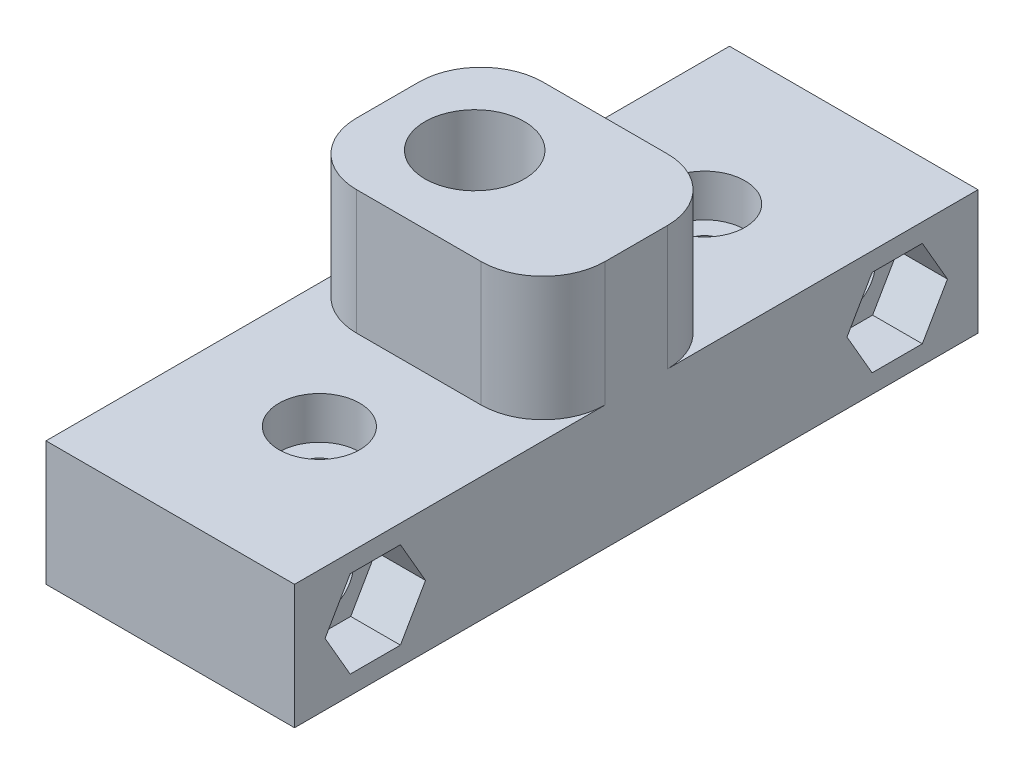
ISO-10303-21;
HEADER;
FILE_DESCRIPTION(('STEP AP214'),'2;1');
FILE_NAME('part.step','',(''),(''),'','','');
FILE_SCHEMA(('AUTOMOTIVE_DESIGN { 1 0 10303 214 1 1 1 1 }'));
ENDSEC;
DATA;
#1=APPLICATION_CONTEXT('core data for automotive mechanical design processes');
#2=APPLICATION_PROTOCOL_DEFINITION('international standard','automotive_design',2000,#1);
#3=PRODUCT_CONTEXT('',#1,'mechanical');
#4=PRODUCT('Part','Part','',(#3));
#5=PRODUCT_RELATED_PRODUCT_CATEGORY('part','',(#4));
#6=PRODUCT_DEFINITION_FORMATION('','',#4);
#7=PRODUCT_DEFINITION_CONTEXT('part definition',#1,'design');
#8=PRODUCT_DEFINITION('design','',#6,#7);
#9=PRODUCT_DEFINITION_SHAPE('','',#8);
#10=(LENGTH_UNIT() NAMED_UNIT(*) SI_UNIT(.MILLI.,.METRE.));
#11=(NAMED_UNIT(*) PLANE_ANGLE_UNIT() SI_UNIT($,.RADIAN.));
#12=(NAMED_UNIT(*) SI_UNIT($,.STERADIAN.) SOLID_ANGLE_UNIT());
#13=UNCERTAINTY_MEASURE_WITH_UNIT(LENGTH_MEASURE(1.E-05),#10,'distance_accuracy_value','');
#14=(GEOMETRIC_REPRESENTATION_CONTEXT(3) GLOBAL_UNCERTAINTY_ASSIGNED_CONTEXT((#13)) GLOBAL_UNIT_ASSIGNED_CONTEXT((#10,
#11,#12)) REPRESENTATION_CONTEXT('',''));
#15=CARTESIAN_POINT('',(0.,0.,0.));
#16=DIRECTION('',(0.,0.,1.));
#17=DIRECTION('',(1.,0.,0.));
#18=AXIS2_PLACEMENT_3D('',#15,#16,#17);
#19=CARTESIAN_POINT('',(10.,5.,21.));
#20=DIRECTION('',(-1.,0.,0.));
#21=DIRECTION('',(0.,0.,1.));
#22=AXIS2_PLACEMENT_3D('',#19,#20,#21);
#23=CYLINDRICAL_SURFACE('',#22,2.25);
#24=CARTESIAN_POINT('',(-10.,5.,21.));
#25=DIRECTION('',(-1.,0.,0.));
#26=DIRECTION('',(0.,0.,1.));
#27=AXIS2_PLACEMENT_3D('',#24,#25,#26);
#28=CIRCLE('',#27,2.25);
#29=CARTESIAN_POINT('',(-10.,5.,23.25));
#30=VERTEX_POINT('',#29);
#31=EDGE_CURVE('E301',#30,#30,#28,.T.);
#32=ORIENTED_EDGE('',*,*,#31,.T.);
#33=EDGE_LOOP('',(#32));
#34=FACE_BOUND('',#33,.T.);
#35=CARTESIAN_POINT('',(6.,5.,21.));
#36=DIRECTION('',(1.,0.,0.));
#37=DIRECTION('',(0.,0.,-1.));
#38=AXIS2_PLACEMENT_3D('',#35,#36,#37);
#39=CIRCLE('',#38,2.25);
#40=CARTESIAN_POINT('',(6.,5.,18.75));
#41=VERTEX_POINT('',#40);
#42=EDGE_CURVE('E37',#41,#41,#39,.F.);
#43=ORIENTED_EDGE('',*,*,#42,.F.);
#44=EDGE_LOOP('',(#43));
#45=FACE_BOUND('',#44,.T.);
#46=ADVANCED_FACE('F33',(#34,#45),#23,.F.);
#47=CARTESIAN_POINT('',(10.,5.,-21.));
#48=DIRECTION('',(-1.,0.,0.));
#49=DIRECTION('',(0.,0.,1.));
#50=AXIS2_PLACEMENT_3D('',#47,#48,#49);
#51=CYLINDRICAL_SURFACE('',#50,2.25);
#52=CARTESIAN_POINT('',(-10.,5.,-21.));
#53=DIRECTION('',(-1.,0.,0.));
#54=DIRECTION('',(0.,0.,1.));
#55=AXIS2_PLACEMENT_3D('',#52,#53,#54);
#56=CIRCLE('',#55,2.25);
#57=CARTESIAN_POINT('',(-10.,5.,-18.75));
#58=VERTEX_POINT('',#57);
#59=EDGE_CURVE('E297',#58,#58,#56,.T.);
#60=ORIENTED_EDGE('',*,*,#59,.T.);
#61=EDGE_LOOP('',(#60));
#62=FACE_BOUND('',#61,.T.);
#63=CARTESIAN_POINT('',(6.,5.,-21.));
#64=DIRECTION('',(1.,0.,0.));
#65=DIRECTION('',(0.,0.,-1.));
#66=AXIS2_PLACEMENT_3D('',#63,#64,#65);
#67=CIRCLE('',#66,2.25);
#68=CARTESIAN_POINT('',(6.,5.,-23.25));
#69=VERTEX_POINT('',#68);
#70=EDGE_CURVE('E244',#69,#69,#67,.F.);
#71=ORIENTED_EDGE('',*,*,#70,.F.);
#72=EDGE_LOOP('',(#71));
#73=FACE_BOUND('',#72,.T.);
#74=ADVANCED_FACE('F426',(#62,#73),#51,.F.);
#75=CARTESIAN_POINT('',(-10.,20.,-27.5));
#76=DIRECTION('',(0.,0.,1.));
#77=DIRECTION('',(1.,0.,0.));
#78=AXIS2_PLACEMENT_3D('',#75,#76,#77);
#79=PLANE('',#78);
#80=DIRECTION('',(-1.,0.,0.));
#81=VECTOR('',#80,1.);
#82=CARTESIAN_POINT('',(-10.,10.,-27.5));
#83=LINE('',#82,#81);
#84=CARTESIAN_POINT('',(10.,10.,-27.5));
#85=VERTEX_POINT('',#84);
#86=CARTESIAN_POINT('',(-10.,10.,-27.5));
#87=VERTEX_POINT('',#86);
#88=EDGE_CURVE('E341',#85,#87,#83,.T.);
#89=ORIENTED_EDGE('',*,*,#88,.F.);
#90=DIRECTION('',(0.,-1.,0.));
#91=VECTOR('',#90,1.);
#92=CARTESIAN_POINT('',(10.,20.,-27.5));
#93=LINE('',#92,#91);
#94=CARTESIAN_POINT('',(10.,0.,-27.5));
#95=VERTEX_POINT('',#94);
#96=EDGE_CURVE('E381',#85,#95,#93,.T.);
#97=ORIENTED_EDGE('',*,*,#96,.T.);
#98=DIRECTION('',(-1.,0.,0.));
#99=VECTOR('',#98,1.);
#100=CARTESIAN_POINT('',(-10.,0.,-27.5));
#101=LINE('',#100,#99);
#102=CARTESIAN_POINT('',(-10.,0.,-27.5));
#103=VERTEX_POINT('',#102);
#104=EDGE_CURVE('E368',#95,#103,#101,.T.);
#105=ORIENTED_EDGE('',*,*,#104,.T.);
#106=DIRECTION('',(0.,-1.,0.));
#107=VECTOR('',#106,1.);
#108=CARTESIAN_POINT('',(-10.,20.,-27.5));
#109=LINE('',#108,#107);
#110=EDGE_CURVE('E379',#87,#103,#109,.T.);
#111=ORIENTED_EDGE('',*,*,#110,.F.);
#112=EDGE_LOOP('',(#89,#97,#105,#111));
#113=FACE_BOUND('',#112,.T.);
#114=ADVANCED_FACE('F433',(#113),#79,.F.);
#115=CARTESIAN_POINT('',(10.,20.,27.5));
#116=DIRECTION('',(-1.,0.,0.));
#117=DIRECTION('',(0.,0.,1.));
#118=AXIS2_PLACEMENT_3D('',#115,#116,#117);
#119=PLANE('',#118);
#120=DIRECTION('',(0.,0.866025403784438,0.5));
#121=VECTOR('',#120,1.);
#122=CARTESIAN_POINT('',(10.,5.,16.9585481156726));
#123=LINE('',#122,#121);
#124=CARTESIAN_POINT('',(10.,5.,16.9585481156726));
#125=VERTEX_POINT('',#124);
#126=CARTESIAN_POINT('',(10.,8.5,18.9792740578363));
#127=VERTEX_POINT('',#126);
#128=EDGE_CURVE('E231',#125,#127,#123,.T.);
#129=ORIENTED_EDGE('',*,*,#128,.F.);
#130=DIRECTION('',(0.,0.866025403784439,-0.5));
#131=VECTOR('',#130,1.);
#132=CARTESIAN_POINT('',(10.,1.49999999999999,18.9792740578363));
#133=LINE('',#132,#131);
#134=CARTESIAN_POINT('',(10.,1.49999999999999,18.9792740578363));
#135=VERTEX_POINT('',#134);
#136=EDGE_CURVE('E50',#135,#125,#133,.T.);
#137=ORIENTED_EDGE('',*,*,#136,.F.);
#138=DIRECTION('',(0.,0.,-1.));
#139=VECTOR('',#138,1.);
#140=CARTESIAN_POINT('',(10.,1.49999999999999,23.0207259421637));
#141=LINE('',#140,#139);
#142=CARTESIAN_POINT('',(10.,1.49999999999999,23.0207259421637));
#143=VERTEX_POINT('',#142);
#144=EDGE_CURVE('E217',#143,#135,#141,.T.);
#145=ORIENTED_EDGE('',*,*,#144,.F.);
#146=DIRECTION('',(0.,-0.866025403784438,-0.5));
#147=VECTOR('',#146,1.);
#148=CARTESIAN_POINT('',(10.,5.,25.0414518843274));
#149=LINE('',#148,#147);
#150=CARTESIAN_POINT('',(10.,5.,25.0414518843274));
#151=VERTEX_POINT('',#150);
#152=EDGE_CURVE('E220',#151,#143,#149,.T.);
#153=ORIENTED_EDGE('',*,*,#152,.F.);
#154=DIRECTION('',(0.,-0.866025403784439,0.5));
#155=VECTOR('',#154,1.);
#156=CARTESIAN_POINT('',(10.,8.5,23.0207259421637));
#157=LINE('',#156,#155);
#158=CARTESIAN_POINT('',(10.,8.5,23.0207259421637));
#159=VERTEX_POINT('',#158);
#160=EDGE_CURVE('E237',#159,#151,#157,.T.);
#161=ORIENTED_EDGE('',*,*,#160,.F.);
#162=DIRECTION('',(0.,0.,1.));
#163=VECTOR('',#162,1.);
#164=CARTESIAN_POINT('',(10.,8.5,18.9792740578363));
#165=LINE('',#164,#163);
#166=EDGE_CURVE('E234',#127,#159,#165,.T.);
#167=ORIENTED_EDGE('',*,*,#166,.F.);
#168=EDGE_LOOP('',(#129,#137,#145,#153,#161,#167));
#169=FACE_BOUND('',#168,.T.);
#170=DIRECTION('',(0.,-0.866025403784438,-0.5));
#171=VECTOR('',#170,1.);
#172=CARTESIAN_POINT('',(10.,5.,-16.9585481156726));
#173=LINE('',#172,#171);
#174=CARTESIAN_POINT('',(10.,5.,-16.9585481156726));
#175=VERTEX_POINT('',#174);
#176=CARTESIAN_POINT('',(10.,1.5,-18.9792740578363));
#177=VERTEX_POINT('',#176);
#178=EDGE_CURVE('E273',#175,#177,#173,.T.);
#179=ORIENTED_EDGE('',*,*,#178,.F.);
#180=DIRECTION('',(0.,-0.866025403784439,0.5));
#181=VECTOR('',#180,1.);
#182=CARTESIAN_POINT('',(10.,8.5,-18.9792740578363));
#183=LINE('',#182,#181);
#184=CARTESIAN_POINT('',(10.,8.5,-18.9792740578363));
#185=VERTEX_POINT('',#184);
#186=EDGE_CURVE('E58',#185,#175,#183,.T.);
#187=ORIENTED_EDGE('',*,*,#186,.F.);
#188=DIRECTION('',(0.,0.,1.));
#189=VECTOR('',#188,1.);
#190=CARTESIAN_POINT('',(10.,8.5,-23.0207259421637));
#191=LINE('',#190,#189);
#192=CARTESIAN_POINT('',(10.,8.5,-23.0207259421637));
#193=VERTEX_POINT('',#192);
#194=EDGE_CURVE('E256',#193,#185,#191,.T.);
#195=ORIENTED_EDGE('',*,*,#194,.F.);
#196=DIRECTION('',(0.,0.866025403784439,0.5));
#197=VECTOR('',#196,1.);
#198=CARTESIAN_POINT('',(10.,5.,-25.0414518843274));
#199=LINE('',#198,#197);
#200=CARTESIAN_POINT('',(10.,5.,-25.0414518843274));
#201=VERTEX_POINT('',#200);
#202=EDGE_CURVE('E282',#201,#193,#199,.T.);
#203=ORIENTED_EDGE('',*,*,#202,.F.);
#204=DIRECTION('',(0.,0.866025403784439,-0.499999999999999));
#205=VECTOR('',#204,1.);
#206=CARTESIAN_POINT('',(10.,1.5,-23.0207259421637));
#207=LINE('',#206,#205);
#208=CARTESIAN_POINT('',(10.,1.5,-23.0207259421637));
#209=VERTEX_POINT('',#208);
#210=EDGE_CURVE('E279',#209,#201,#207,.T.);
#211=ORIENTED_EDGE('',*,*,#210,.F.);
#212=DIRECTION('',(0.,0.,-1.));
#213=VECTOR('',#212,1.);
#214=CARTESIAN_POINT('',(10.,1.5,-18.9792740578363));
#215=LINE('',#214,#213);
#216=EDGE_CURVE('E276',#177,#209,#215,.T.);
#217=ORIENTED_EDGE('',*,*,#216,.F.);
#218=EDGE_LOOP('',(#179,#187,#195,#203,#211,#217));
#219=FACE_BOUND('',#218,.T.);
#220=DIRECTION('',(0.,0.,-1.));
#221=VECTOR('',#220,1.);
#222=CARTESIAN_POINT('',(10.,10.,-27.5));
#223=LINE('',#222,#221);
#224=CARTESIAN_POINT('',(10.,10.,-2.50000000000001));
#225=VERTEX_POINT('',#224);
#226=EDGE_CURVE('E347',#225,#85,#223,.T.);
#227=ORIENTED_EDGE('',*,*,#226,.F.);
#228=DIRECTION('',(0.,1.,0.));
#229=VECTOR('',#228,1.);
#230=CARTESIAN_POINT('',(10.,20.,-2.50000000000001));
#231=LINE('',#230,#229);
#232=CARTESIAN_POINT('',(10.,20.,-2.50000000000001));
#233=VERTEX_POINT('',#232);
#234=EDGE_CURVE('E410',#225,#233,#231,.T.);
#235=ORIENTED_EDGE('',*,*,#234,.T.);
#236=DIRECTION('',(0.,0.,-1.));
#237=VECTOR('',#236,1.);
#238=CARTESIAN_POINT('',(10.,20.,27.5));
#239=LINE('',#238,#237);
#240=CARTESIAN_POINT('',(10.,20.,2.5));
#241=VERTEX_POINT('',#240);
#242=EDGE_CURVE('E358',#241,#233,#239,.T.);
#243=ORIENTED_EDGE('',*,*,#242,.F.);
#244=DIRECTION('',(0.,1.,0.));
#245=VECTOR('',#244,1.);
#246=CARTESIAN_POINT('',(10.,20.,2.5));
#247=LINE('',#246,#245);
#248=CARTESIAN_POINT('',(10.,10.,2.5));
#249=VERTEX_POINT('',#248);
#250=EDGE_CURVE('E407',#241,#249,#247,.F.);
#251=ORIENTED_EDGE('',*,*,#250,.T.);
#252=DIRECTION('',(0.,0.,-1.));
#253=VECTOR('',#252,1.);
#254=CARTESIAN_POINT('',(10.,10.,27.5));
#255=LINE('',#254,#253);
#256=CARTESIAN_POINT('',(10.,10.,27.5));
#257=VERTEX_POINT('',#256);
#258=EDGE_CURVE('E333',#257,#249,#255,.T.);
#259=ORIENTED_EDGE('',*,*,#258,.F.);
#260=DIRECTION('',(0.,-1.,0.));
#261=VECTOR('',#260,1.);
#262=CARTESIAN_POINT('',(10.,20.,27.5));
#263=LINE('',#262,#261);
#264=CARTESIAN_POINT('',(10.,0.,27.5));
#265=VERTEX_POINT('',#264);
#266=EDGE_CURVE('E365',#257,#265,#263,.T.);
#267=ORIENTED_EDGE('',*,*,#266,.T.);
#268=DIRECTION('',(0.,0.,-1.));
#269=VECTOR('',#268,1.);
#270=CARTESIAN_POINT('',(10.,0.,27.5));
#271=LINE('',#270,#269);
#272=EDGE_CURVE('E355',#265,#95,#271,.T.);
#273=ORIENTED_EDGE('',*,*,#272,.T.);
#274=ORIENTED_EDGE('',*,*,#96,.F.);
#275=EDGE_LOOP('',(#227,#235,#243,#251,#259,#267,#273,#274));
#276=FACE_BOUND('',#275,.T.);
#277=ADVANCED_FACE('F502',(#169,#219,#276),#119,.F.);
#278=CARTESIAN_POINT('',(-10.,20.,27.5));
#279=DIRECTION('',(1.,0.,0.));
#280=DIRECTION('',(0.,0.,-1.));
#281=AXIS2_PLACEMENT_3D('',#278,#279,#280);
#282=PLANE('',#281);
#283=ORIENTED_EDGE('',*,*,#59,.F.);
#284=EDGE_LOOP('',(#283));
#285=FACE_BOUND('',#284,.T.);
#286=ORIENTED_EDGE('',*,*,#31,.F.);
#287=EDGE_LOOP('',(#286));
#288=FACE_BOUND('',#287,.T.);
#289=DIRECTION('',(0.,0.,1.));
#290=VECTOR('',#289,1.);
#291=CARTESIAN_POINT('',(-10.,20.,27.5));
#292=LINE('',#291,#290);
#293=CARTESIAN_POINT('',(-10.,20.,-2.50000000000001));
#294=VERTEX_POINT('',#293);
#295=CARTESIAN_POINT('',(-10.,20.,2.5));
#296=VERTEX_POINT('',#295);
#297=EDGE_CURVE('E361',#294,#296,#292,.T.);
#298=ORIENTED_EDGE('',*,*,#297,.F.);
#299=DIRECTION('',(0.,1.,0.));
#300=VECTOR('',#299,1.);
#301=CARTESIAN_POINT('',(-10.,20.,-2.50000000000001));
#302=LINE('',#301,#300);
#303=CARTESIAN_POINT('',(-10.,10.,-2.50000000000001));
#304=VERTEX_POINT('',#303);
#305=EDGE_CURVE('E399',#294,#304,#302,.F.);
#306=ORIENTED_EDGE('',*,*,#305,.T.);
#307=DIRECTION('',(0.,0.,1.));
#308=VECTOR('',#307,1.);
#309=CARTESIAN_POINT('',(-10.,10.,-27.5));
#310=LINE('',#309,#308);
#311=EDGE_CURVE('E342',#87,#304,#310,.T.);
#312=ORIENTED_EDGE('',*,*,#311,.F.);
#313=ORIENTED_EDGE('',*,*,#110,.T.);
#314=DIRECTION('',(0.,0.,1.));
#315=VECTOR('',#314,1.);
#316=CARTESIAN_POINT('',(-10.,0.,27.5));
#317=LINE('',#316,#315);
#318=CARTESIAN_POINT('',(-10.,0.,27.5));
#319=VERTEX_POINT('',#318);
#320=EDGE_CURVE('E371',#103,#319,#317,.T.);
#321=ORIENTED_EDGE('',*,*,#320,.T.);
#322=DIRECTION('',(0.,-1.,0.));
#323=VECTOR('',#322,1.);
#324=CARTESIAN_POINT('',(-10.,20.,27.5));
#325=LINE('',#324,#323);
#326=CARTESIAN_POINT('',(-10.,10.,27.5));
#327=VERTEX_POINT('',#326);
#328=EDGE_CURVE('E377',#327,#319,#325,.T.);
#329=ORIENTED_EDGE('',*,*,#328,.F.);
#330=DIRECTION('',(0.,0.,1.));
#331=VECTOR('',#330,1.);
#332=CARTESIAN_POINT('',(-10.,10.,27.5));
#333=LINE('',#332,#331);
#334=CARTESIAN_POINT('',(-10.,10.,2.5));
#335=VERTEX_POINT('',#334);
#336=EDGE_CURVE('E328',#335,#327,#333,.T.);
#337=ORIENTED_EDGE('',*,*,#336,.F.);
#338=DIRECTION('',(0.,1.,0.));
#339=VECTOR('',#338,1.);
#340=CARTESIAN_POINT('',(-10.,20.,2.5));
#341=LINE('',#340,#339);
#342=EDGE_CURVE('E396',#335,#296,#341,.T.);
#343=ORIENTED_EDGE('',*,*,#342,.T.);
#344=EDGE_LOOP('',(#298,#306,#312,#313,#321,#329,#337,#343));
#345=FACE_BOUND('',#344,.T.);
#346=ADVANCED_FACE('F498',(#285,#288,#345),#282,.F.);
#347=CARTESIAN_POINT('',(-10.,20.,27.5));
#348=DIRECTION('',(0.,0.,-1.));
#349=DIRECTION('',(-1.,0.,0.));
#350=AXIS2_PLACEMENT_3D('',#347,#348,#349);
#351=PLANE('',#350);
#352=ORIENTED_EDGE('',*,*,#266,.F.);
#353=DIRECTION('',(1.,0.,0.));
#354=VECTOR('',#353,1.);
#355=CARTESIAN_POINT('',(-10.,10.,27.5));
#356=LINE('',#355,#354);
#357=EDGE_CURVE('E330',#327,#257,#356,.T.);
#358=ORIENTED_EDGE('',*,*,#357,.F.);
#359=ORIENTED_EDGE('',*,*,#328,.T.);
#360=DIRECTION('',(1.,0.,0.));
#361=VECTOR('',#360,1.);
#362=CARTESIAN_POINT('',(-10.,0.,27.5));
#363=LINE('',#362,#361);
#364=EDGE_CURVE('E362',#319,#265,#363,.T.);
#365=ORIENTED_EDGE('',*,*,#364,.T.);
#366=EDGE_LOOP('',(#352,#358,#359,#365));
#367=FACE_BOUND('',#366,.T.);
#368=ADVANCED_FACE('F491',(#367),#351,.F.);
#369=CARTESIAN_POINT('',(0.,20.,0.));
#370=DIRECTION('',(0.,-1.,0.));
#371=DIRECTION('',(0.,0.,-1.));
#372=AXIS2_PLACEMENT_3D('',#369,#370,#371);
#373=PLANE('',#372);
#374=CARTESIAN_POINT('',(-3.,20.,0.));
#375=DIRECTION('',(0.,1.,0.));
#376=DIRECTION('',(0.,0.,1.));
#377=AXIS2_PLACEMENT_3D('',#374,#375,#376);
#378=CIRCLE('',#377,4.);
#379=CARTESIAN_POINT('',(-3.,20.,4.));
#380=VERTEX_POINT('',#379);
#381=EDGE_CURVE('E338',#380,#380,#378,.T.);
#382=ORIENTED_EDGE('',*,*,#381,.F.);
#383=EDGE_LOOP('',(#382));
#384=FACE_BOUND('',#383,.T.);
#385=DIRECTION('',(1.,0.,0.));
#386=VECTOR('',#385,1.);
#387=CARTESIAN_POINT('',(-10.,20.,-7.50000000000001));
#388=LINE('',#387,#386);
#389=CARTESIAN_POINT('',(-5.,20.,-7.50000000000001));
#390=VERTEX_POINT('',#389);
#391=CARTESIAN_POINT('',(5.,20.,-7.50000000000001));
#392=VERTEX_POINT('',#391);
#393=EDGE_CURVE('E327',#390,#392,#388,.T.);
#394=ORIENTED_EDGE('',*,*,#393,.F.);
#395=CARTESIAN_POINT('',(-5.,20.,-2.50000000000001));
#396=DIRECTION('',(0.,-1.,0.));
#397=DIRECTION('',(0.,0.,-1.));
#398=AXIS2_PLACEMENT_3D('',#395,#396,#397);
#399=CIRCLE('',#398,5.);
#400=EDGE_CURVE('E394',#390,#294,#399,.F.);
#401=ORIENTED_EDGE('',*,*,#400,.T.);
#402=ORIENTED_EDGE('',*,*,#297,.T.);
#403=CARTESIAN_POINT('',(-5.,20.,2.5));
#404=DIRECTION('',(0.,-1.,0.));
#405=DIRECTION('',(0.,0.,-1.));
#406=AXIS2_PLACEMENT_3D('',#403,#404,#405);
#407=CIRCLE('',#406,5.);
#408=CARTESIAN_POINT('',(-5.,20.,7.5));
#409=VERTEX_POINT('',#408);
#410=EDGE_CURVE('E392',#296,#409,#407,.F.);
#411=ORIENTED_EDGE('',*,*,#410,.T.);
#412=DIRECTION('',(-1.,0.,0.));
#413=VECTOR('',#412,1.);
#414=CARTESIAN_POINT('',(-10.,20.,7.5));
#415=LINE('',#414,#413);
#416=CARTESIAN_POINT('',(5.,20.,7.5));
#417=VERTEX_POINT('',#416);
#418=EDGE_CURVE('E331',#417,#409,#415,.T.);
#419=ORIENTED_EDGE('',*,*,#418,.F.);
#420=CARTESIAN_POINT('',(5.,20.,2.5));
#421=DIRECTION('',(0.,-1.,0.));
#422=DIRECTION('',(0.,0.,-1.));
#423=AXIS2_PLACEMENT_3D('',#420,#421,#422);
#424=CIRCLE('',#423,5.);
#425=EDGE_CURVE('E388',#417,#241,#424,.F.);
#426=ORIENTED_EDGE('',*,*,#425,.T.);
#427=ORIENTED_EDGE('',*,*,#242,.T.);
#428=CARTESIAN_POINT('',(5.,20.,-2.50000000000001));
#429=DIRECTION('',(0.,-1.,0.));
#430=DIRECTION('',(0.,0.,-1.));
#431=AXIS2_PLACEMENT_3D('',#428,#429,#430);
#432=CIRCLE('',#431,5.);
#433=EDGE_CURVE('E390',#233,#392,#432,.F.);
#434=ORIENTED_EDGE('',*,*,#433,.T.);
#435=EDGE_LOOP('',(#394,#401,#402,#411,#419,#426,#427,#434));
#436=FACE_BOUND('',#435,.T.);
#437=ADVANCED_FACE('F488',(#384,#436),#373,.F.);
#438=CARTESIAN_POINT('',(0.,0.,0.));
#439=DIRECTION('',(0.,-1.,0.));
#440=DIRECTION('',(0.,0.,-1.));
#441=AXIS2_PLACEMENT_3D('',#438,#439,#440);
#442=PLANE('',#441);
#443=CARTESIAN_POINT('',(0.,0.,15.5));
#444=DIRECTION('',(0.,1.,0.));
#445=DIRECTION('',(0.,0.,1.));
#446=AXIS2_PLACEMENT_3D('',#443,#444,#445);
#447=CIRCLE('',#446,1.7);
#448=CARTESIAN_POINT('',(0.,0.,17.2));
#449=VERTEX_POINT('',#448);
#450=EDGE_CURVE('E312',#449,#449,#447,.T.);
#451=ORIENTED_EDGE('',*,*,#450,.T.);
#452=EDGE_LOOP('',(#451));
#453=FACE_BOUND('',#452,.T.);
#454=CARTESIAN_POINT('',(0.,0.,-15.5));
#455=DIRECTION('',(0.,1.,0.));
#456=DIRECTION('',(0.,0.,1.));
#457=AXIS2_PLACEMENT_3D('',#454,#455,#456);
#458=CIRCLE('',#457,1.7);
#459=CARTESIAN_POINT('',(0.,0.,-13.8));
#460=VERTEX_POINT('',#459);
#461=EDGE_CURVE('E324',#460,#460,#458,.T.);
#462=ORIENTED_EDGE('',*,*,#461,.T.);
#463=EDGE_LOOP('',(#462));
#464=FACE_BOUND('',#463,.T.);
#465=ORIENTED_EDGE('',*,*,#272,.F.);
#466=ORIENTED_EDGE('',*,*,#364,.F.);
#467=ORIENTED_EDGE('',*,*,#320,.F.);
#468=ORIENTED_EDGE('',*,*,#104,.F.);
#469=EDGE_LOOP('',(#465,#466,#467,#468));
#470=FACE_BOUND('',#469,.T.);
#471=ADVANCED_FACE('F486',(#453,#464,#470),#442,.T.);
#472=CARTESIAN_POINT('',(-3.,10.,0.));
#473=DIRECTION('',(0.,1.,0.));
#474=DIRECTION('',(0.,0.,1.));
#475=AXIS2_PLACEMENT_3D('',#472,#473,#474);
#476=CYLINDRICAL_SURFACE('',#475,4.);
#477=CARTESIAN_POINT('',(-3.,10.,0.));
#478=DIRECTION('',(0.,1.,0.));
#479=DIRECTION('',(0.,0.,1.));
#480=AXIS2_PLACEMENT_3D('',#477,#478,#479);
#481=CIRCLE('',#480,4.);
#482=CARTESIAN_POINT('',(-3.,10.,4.));
#483=VERTEX_POINT('',#482);
#484=EDGE_CURVE('E352',#483,#483,#481,.T.);
#485=ORIENTED_EDGE('',*,*,#484,.F.);
#486=EDGE_LOOP('',(#485));
#487=FACE_BOUND('',#486,.T.);
#488=ORIENTED_EDGE('',*,*,#381,.T.);
#489=EDGE_LOOP('',(#488));
#490=FACE_BOUND('',#489,.T.);
#491=ADVANCED_FACE('F482',(#487,#490),#476,.F.);
#492=CARTESIAN_POINT('',(-3.,10.,0.));
#493=DIRECTION('',(0.,1.,0.));
#494=DIRECTION('',(0.,0.,1.));
#495=AXIS2_PLACEMENT_3D('',#492,#493,#494);
#496=PLANE('',#495);
#497=ORIENTED_EDGE('',*,*,#484,.T.);
#498=EDGE_LOOP('',(#497));
#499=FACE_BOUND('',#498,.T.);
#500=ADVANCED_FACE('F478',(#499),#496,.T.);
#501=CARTESIAN_POINT('',(-10.,10.,-7.50000000000001));
#502=DIRECTION('',(0.,0.,1.));
#503=DIRECTION('',(1.,0.,0.));
#504=AXIS2_PLACEMENT_3D('',#501,#502,#503);
#505=PLANE('',#504);
#506=DIRECTION('',(1.,0.,0.));
#507=VECTOR('',#506,1.);
#508=CARTESIAN_POINT('',(-10.,10.,-7.50000000000001));
#509=LINE('',#508,#507);
#510=CARTESIAN_POINT('',(-5.,10.,-7.50000000000001));
#511=VERTEX_POINT('',#510);
#512=CARTESIAN_POINT('',(5.,10.,-7.50000000000001));
#513=VERTEX_POINT('',#512);
#514=EDGE_CURVE('E344',#511,#513,#509,.T.);
#515=ORIENTED_EDGE('',*,*,#514,.F.);
#516=DIRECTION('',(0.,1.,0.));
#517=VECTOR('',#516,1.);
#518=CARTESIAN_POINT('',(-5.,10.,-7.50000000000001));
#519=LINE('',#518,#517);
#520=EDGE_CURVE('E385',#511,#390,#519,.T.);
#521=ORIENTED_EDGE('',*,*,#520,.T.);
#522=ORIENTED_EDGE('',*,*,#393,.T.);
#523=DIRECTION('',(0.,1.,0.));
#524=VECTOR('',#523,1.);
#525=CARTESIAN_POINT('',(5.,10.,-7.50000000000001));
#526=LINE('',#525,#524);
#527=EDGE_CURVE('E383',#392,#513,#526,.F.);
#528=ORIENTED_EDGE('',*,*,#527,.T.);
#529=EDGE_LOOP('',(#515,#521,#522,#528));
#530=FACE_BOUND('',#529,.T.);
#531=ADVANCED_FACE('F474',(#530),#505,.F.);
#532=CARTESIAN_POINT('',(0.,10.,0.));
#533=DIRECTION('',(0.,1.,0.));
#534=DIRECTION('',(0.,0.,1.));
#535=AXIS2_PLACEMENT_3D('',#532,#533,#534);
#536=PLANE('',#535);
#537=CARTESIAN_POINT('',(0.,10.,-15.5));
#538=DIRECTION('',(0.,1.,0.));
#539=DIRECTION('',(0.,0.,1.));
#540=AXIS2_PLACEMENT_3D('',#537,#538,#539);
#541=CIRCLE('',#540,3.25);
#542=CARTESIAN_POINT('',(0.,10.,-12.25));
#543=VERTEX_POINT('',#542);
#544=EDGE_CURVE('E315',#543,#543,#541,.T.);
#545=ORIENTED_EDGE('',*,*,#544,.F.);
#546=EDGE_LOOP('',(#545));
#547=FACE_BOUND('',#546,.T.);
#548=ORIENTED_EDGE('',*,*,#311,.T.);
#549=CARTESIAN_POINT('',(-5.,10.,-2.50000000000001));
#550=DIRECTION('',(0.,1.,0.));
#551=DIRECTION('',(0.,0.,1.));
#552=AXIS2_PLACEMENT_3D('',#549,#550,#551);
#553=CIRCLE('',#552,5.);
#554=EDGE_CURVE('E413',#304,#511,#553,.F.);
#555=ORIENTED_EDGE('',*,*,#554,.T.);
#556=ORIENTED_EDGE('',*,*,#514,.T.);
#557=CARTESIAN_POINT('',(5.,10.,-2.50000000000001));
#558=DIRECTION('',(0.,1.,0.));
#559=DIRECTION('',(0.,0.,1.));
#560=AXIS2_PLACEMENT_3D('',#557,#558,#559);
#561=CIRCLE('',#560,5.);
#562=EDGE_CURVE('E42',#513,#225,#561,.F.);
#563=ORIENTED_EDGE('',*,*,#562,.T.);
#564=ORIENTED_EDGE('',*,*,#226,.T.);
#565=ORIENTED_EDGE('',*,*,#88,.T.);
#566=EDGE_LOOP('',(#548,#555,#556,#563,#564,#565));
#567=FACE_BOUND('',#566,.T.);
#568=ADVANCED_FACE('F470',(#547,#567),#536,.T.);
#569=CARTESIAN_POINT('',(-10.,10.,7.5));
#570=DIRECTION('',(0.,0.,-1.));
#571=DIRECTION('',(-1.,0.,0.));
#572=AXIS2_PLACEMENT_3D('',#569,#570,#571);
#573=PLANE('',#572);
#574=ORIENTED_EDGE('',*,*,#418,.T.);
#575=DIRECTION('',(0.,1.,0.));
#576=VECTOR('',#575,1.);
#577=CARTESIAN_POINT('',(-5.,10.,7.5));
#578=LINE('',#577,#576);
#579=CARTESIAN_POINT('',(-5.,10.,7.5));
#580=VERTEX_POINT('',#579);
#581=EDGE_CURVE('E405',#409,#580,#578,.F.);
#582=ORIENTED_EDGE('',*,*,#581,.T.);
#583=DIRECTION('',(-1.,0.,0.));
#584=VECTOR('',#583,1.);
#585=CARTESIAN_POINT('',(-10.,10.,7.5));
#586=LINE('',#585,#584);
#587=CARTESIAN_POINT('',(5.,10.,7.5));
#588=VERTEX_POINT('',#587);
#589=EDGE_CURVE('E335',#588,#580,#586,.T.);
#590=ORIENTED_EDGE('',*,*,#589,.F.);
#591=DIRECTION('',(0.,1.,0.));
#592=VECTOR('',#591,1.);
#593=CARTESIAN_POINT('',(5.,10.,7.5));
#594=LINE('',#593,#592);
#595=EDGE_CURVE('E402',#588,#417,#594,.T.);
#596=ORIENTED_EDGE('',*,*,#595,.T.);
#597=EDGE_LOOP('',(#574,#582,#590,#596));
#598=FACE_BOUND('',#597,.T.);
#599=ADVANCED_FACE('F466',(#598),#573,.F.);
#600=CARTESIAN_POINT('',(0.,10.,0.));
#601=DIRECTION('',(0.,-1.,0.));
#602=DIRECTION('',(0.,0.,-1.));
#603=AXIS2_PLACEMENT_3D('',#600,#601,#602);
#604=PLANE('',#603);
#605=CARTESIAN_POINT('',(0.,10.,15.5));
#606=DIRECTION('',(0.,1.,0.));
#607=DIRECTION('',(0.,0.,1.));
#608=AXIS2_PLACEMENT_3D('',#605,#606,#607);
#609=CIRCLE('',#608,3.25);
#610=CARTESIAN_POINT('',(0.,10.,18.75));
#611=VERTEX_POINT('',#610);
#612=EDGE_CURVE('E300',#611,#611,#609,.T.);
#613=ORIENTED_EDGE('',*,*,#612,.F.);
#614=EDGE_LOOP('',(#613));
#615=FACE_BOUND('',#614,.T.);
#616=ORIENTED_EDGE('',*,*,#336,.T.);
#617=ORIENTED_EDGE('',*,*,#357,.T.);
#618=ORIENTED_EDGE('',*,*,#258,.T.);
#619=CARTESIAN_POINT('',(5.,10.,2.5));
#620=DIRECTION('',(0.,-1.,0.));
#621=DIRECTION('',(0.,0.,-1.));
#622=AXIS2_PLACEMENT_3D('',#619,#620,#621);
#623=CIRCLE('',#622,5.);
#624=EDGE_CURVE('E11',#249,#588,#623,.T.);
#625=ORIENTED_EDGE('',*,*,#624,.T.);
#626=ORIENTED_EDGE('',*,*,#589,.T.);
#627=CARTESIAN_POINT('',(-5.,10.,2.5));
#628=DIRECTION('',(0.,-1.,0.));
#629=DIRECTION('',(0.,0.,-1.));
#630=AXIS2_PLACEMENT_3D('',#627,#628,#629);
#631=CIRCLE('',#630,5.);
#632=EDGE_CURVE('E415',#580,#335,#631,.T.);
#633=ORIENTED_EDGE('',*,*,#632,.T.);
#634=EDGE_LOOP('',(#616,#617,#618,#625,#626,#633));
#635=FACE_BOUND('',#634,.T.);
#636=ADVANCED_FACE('F462',(#615,#635),#604,.F.);
#637=CARTESIAN_POINT('',(0.,10.,-15.5));
#638=DIRECTION('',(0.,1.,0.));
#639=DIRECTION('',(0.,0.,1.));
#640=AXIS2_PLACEMENT_3D('',#637,#638,#639);
#641=CYLINDRICAL_SURFACE('',#640,1.70000000000001);
#642=ORIENTED_EDGE('',*,*,#461,.F.);
#643=EDGE_LOOP('',(#642));
#644=FACE_BOUND('',#643,.T.);
#645=CARTESIAN_POINT('',(0.,6.6,-15.5));
#646=DIRECTION('',(0.,1.,0.));
#647=DIRECTION('',(0.,0.,1.));
#648=AXIS2_PLACEMENT_3D('',#645,#646,#647);
#649=CIRCLE('',#648,1.70000000000001);
#650=CARTESIAN_POINT('',(0.,6.6,-13.8));
#651=VERTEX_POINT('',#650);
#652=EDGE_CURVE('E321',#651,#651,#649,.T.);
#653=ORIENTED_EDGE('',*,*,#652,.T.);
#654=EDGE_LOOP('',(#653));
#655=FACE_BOUND('',#654,.T.);
#656=ADVANCED_FACE('F458',(#644,#655),#641,.F.);
#657=CARTESIAN_POINT('',(1.70000000000001,6.6,-15.5));
#658=DIRECTION('',(0.,-1.,0.));
#659=DIRECTION('',(0.,0.,-1.));
#660=AXIS2_PLACEMENT_3D('',#657,#658,#659);
#661=PLANE('',#660);
#662=ORIENTED_EDGE('',*,*,#652,.F.);
#663=EDGE_LOOP('',(#662));
#664=FACE_BOUND('',#663,.T.);
#665=CARTESIAN_POINT('',(0.,6.6,-15.5));
#666=DIRECTION('',(0.,1.,0.));
#667=DIRECTION('',(0.,0.,1.));
#668=AXIS2_PLACEMENT_3D('',#665,#666,#667);
#669=CIRCLE('',#668,3.25);
#670=CARTESIAN_POINT('',(0.,6.6,-12.25));
#671=VERTEX_POINT('',#670);
#672=EDGE_CURVE('E318',#671,#671,#669,.T.);
#673=ORIENTED_EDGE('',*,*,#672,.T.);
#674=EDGE_LOOP('',(#673));
#675=FACE_BOUND('',#674,.T.);
#676=ADVANCED_FACE('F454',(#664,#675),#661,.F.);
#677=CARTESIAN_POINT('',(0.,10.,-15.5));
#678=DIRECTION('',(0.,1.,0.));
#679=DIRECTION('',(0.,0.,1.));
#680=AXIS2_PLACEMENT_3D('',#677,#678,#679);
#681=CYLINDRICAL_SURFACE('',#680,3.25);
#682=ORIENTED_EDGE('',*,*,#672,.F.);
#683=EDGE_LOOP('',(#682));
#684=FACE_BOUND('',#683,.T.);
#685=ORIENTED_EDGE('',*,*,#544,.T.);
#686=EDGE_LOOP('',(#685));
#687=FACE_BOUND('',#686,.T.);
#688=ADVANCED_FACE('F450',(#684,#687),#681,.F.);
#689=CARTESIAN_POINT('',(0.,10.,15.5));
#690=DIRECTION('',(0.,1.,0.));
#691=DIRECTION('',(0.,0.,1.));
#692=AXIS2_PLACEMENT_3D('',#689,#690,#691);
#693=CYLINDRICAL_SURFACE('',#692,1.70000000000001);
#694=ORIENTED_EDGE('',*,*,#450,.F.);
#695=EDGE_LOOP('',(#694));
#696=FACE_BOUND('',#695,.T.);
#697=CARTESIAN_POINT('',(0.,6.6,15.5));
#698=DIRECTION('',(0.,1.,0.));
#699=DIRECTION('',(0.,0.,1.));
#700=AXIS2_PLACEMENT_3D('',#697,#698,#699);
#701=CIRCLE('',#700,1.70000000000001);
#702=CARTESIAN_POINT('',(0.,6.6,17.2));
#703=VERTEX_POINT('',#702);
#704=EDGE_CURVE('E309',#703,#703,#701,.T.);
#705=ORIENTED_EDGE('',*,*,#704,.T.);
#706=EDGE_LOOP('',(#705));
#707=FACE_BOUND('',#706,.T.);
#708=ADVANCED_FACE('F446',(#696,#707),#693,.F.);
#709=CARTESIAN_POINT('',(1.70000000000001,6.6,15.5));
#710=DIRECTION('',(0.,-1.,0.));
#711=DIRECTION('',(0.,0.,-1.));
#712=AXIS2_PLACEMENT_3D('',#709,#710,#711);
#713=PLANE('',#712);
#714=ORIENTED_EDGE('',*,*,#704,.F.);
#715=EDGE_LOOP('',(#714));
#716=FACE_BOUND('',#715,.T.);
#717=CARTESIAN_POINT('',(0.,6.6,15.5));
#718=DIRECTION('',(0.,1.,0.));
#719=DIRECTION('',(0.,0.,1.));
#720=AXIS2_PLACEMENT_3D('',#717,#718,#719);
#721=CIRCLE('',#720,3.25);
#722=CARTESIAN_POINT('',(0.,6.6,18.75));
#723=VERTEX_POINT('',#722);
#724=EDGE_CURVE('E306',#723,#723,#721,.T.);
#725=ORIENTED_EDGE('',*,*,#724,.T.);
#726=EDGE_LOOP('',(#725));
#727=FACE_BOUND('',#726,.T.);
#728=ADVANCED_FACE('F442',(#716,#727),#713,.F.);
#729=CARTESIAN_POINT('',(0.,10.,15.5));
#730=DIRECTION('',(0.,1.,0.));
#731=DIRECTION('',(0.,0.,1.));
#732=AXIS2_PLACEMENT_3D('',#729,#730,#731);
#733=CYLINDRICAL_SURFACE('',#732,3.25);
#734=ORIENTED_EDGE('',*,*,#724,.F.);
#735=EDGE_LOOP('',(#734));
#736=FACE_BOUND('',#735,.T.);
#737=ORIENTED_EDGE('',*,*,#612,.T.);
#738=EDGE_LOOP('',(#737));
#739=FACE_BOUND('',#738,.T.);
#740=ADVANCED_FACE('F438',(#736,#739),#733,.F.);
#741=CARTESIAN_POINT('',(-5.,10.,-2.50000000000001));
#742=DIRECTION('',(0.,1.,0.));
#743=DIRECTION('',(0.,0.,1.));
#744=AXIS2_PLACEMENT_3D('',#741,#742,#743);
#745=CYLINDRICAL_SURFACE('',#744,5.);
#746=ORIENTED_EDGE('',*,*,#554,.F.);
#747=ORIENTED_EDGE('',*,*,#305,.F.);
#748=ORIENTED_EDGE('',*,*,#400,.F.);
#749=ORIENTED_EDGE('',*,*,#520,.F.);
#750=EDGE_LOOP('',(#746,#747,#748,#749));
#751=FACE_BOUND('',#750,.T.);
#752=ADVANCED_FACE('F441',(#751),#745,.T.);
#753=CARTESIAN_POINT('',(-5.,20.,2.5));
#754=DIRECTION('',(0.,1.,0.));
#755=DIRECTION('',(0.,0.,1.));
#756=AXIS2_PLACEMENT_3D('',#753,#754,#755);
#757=CYLINDRICAL_SURFACE('',#756,5.);
#758=ORIENTED_EDGE('',*,*,#632,.F.);
#759=ORIENTED_EDGE('',*,*,#581,.F.);
#760=ORIENTED_EDGE('',*,*,#410,.F.);
#761=ORIENTED_EDGE('',*,*,#342,.F.);
#762=EDGE_LOOP('',(#758,#759,#760,#761));
#763=FACE_BOUND('',#762,.T.);
#764=ADVANCED_FACE('F512',(#763),#757,.T.);
#765=CARTESIAN_POINT('',(5.,20.,-2.50000000000001));
#766=DIRECTION('',(0.,1.,0.));
#767=DIRECTION('',(0.,0.,1.));
#768=AXIS2_PLACEMENT_3D('',#765,#766,#767);
#769=CYLINDRICAL_SURFACE('',#768,5.);
#770=ORIENTED_EDGE('',*,*,#562,.F.);
#771=ORIENTED_EDGE('',*,*,#527,.F.);
#772=ORIENTED_EDGE('',*,*,#433,.F.);
#773=ORIENTED_EDGE('',*,*,#234,.F.);
#774=EDGE_LOOP('',(#770,#771,#772,#773));
#775=FACE_BOUND('',#774,.T.);
#776=ADVANCED_FACE('F515',(#775),#769,.T.);
#777=CARTESIAN_POINT('',(5.,10.,2.5));
#778=DIRECTION('',(0.,1.,0.));
#779=DIRECTION('',(0.,0.,1.));
#780=AXIS2_PLACEMENT_3D('',#777,#778,#779);
#781=CYLINDRICAL_SURFACE('',#780,5.);
#782=ORIENTED_EDGE('',*,*,#624,.F.);
#783=ORIENTED_EDGE('',*,*,#250,.F.);
#784=ORIENTED_EDGE('',*,*,#425,.F.);
#785=ORIENTED_EDGE('',*,*,#595,.F.);
#786=EDGE_LOOP('',(#782,#783,#784,#785));
#787=FACE_BOUND('',#786,.T.);
#788=ADVANCED_FACE('F35',(#787),#781,.T.);
#789=CARTESIAN_POINT('',(6.,0.,0.));
#790=DIRECTION('',(1.,0.,0.));
#791=DIRECTION('',(0.,0.,-1.));
#792=AXIS2_PLACEMENT_3D('',#789,#790,#791);
#793=PLANE('',#792);
#794=DIRECTION('',(0.,-0.866025403784439,0.5));
#795=VECTOR('',#794,1.);
#796=CARTESIAN_POINT('',(6.,8.5,-18.9792740578363));
#797=LINE('',#796,#795);
#798=CARTESIAN_POINT('',(6.,8.5,-18.9792740578363));
#799=VERTEX_POINT('',#798);
#800=CARTESIAN_POINT('',(6.,5.,-16.9585481156726));
#801=VERTEX_POINT('',#800);
#802=EDGE_CURVE('E252',#799,#801,#797,.T.);
#803=ORIENTED_EDGE('',*,*,#802,.T.);
#804=DIRECTION('',(0.,-0.866025403784438,-0.5));
#805=VECTOR('',#804,1.);
#806=CARTESIAN_POINT('',(6.,5.,-16.9585481156726));
#807=LINE('',#806,#805);
#808=CARTESIAN_POINT('',(6.,1.5,-18.9792740578363));
#809=VERTEX_POINT('',#808);
#810=EDGE_CURVE('E255',#801,#809,#807,.T.);
#811=ORIENTED_EDGE('',*,*,#810,.T.);
#812=DIRECTION('',(0.,0.,-1.));
#813=VECTOR('',#812,1.);
#814=CARTESIAN_POINT('',(6.,1.5,-18.9792740578363));
#815=LINE('',#814,#813);
#816=CARTESIAN_POINT('',(6.,1.5,-23.0207259421637));
#817=VERTEX_POINT('',#816);
#818=EDGE_CURVE('E259',#809,#817,#815,.T.);
#819=ORIENTED_EDGE('',*,*,#818,.T.);
#820=DIRECTION('',(0.,0.866025403784439,-0.499999999999999));
#821=VECTOR('',#820,1.);
#822=CARTESIAN_POINT('',(6.,1.5,-23.0207259421637));
#823=LINE('',#822,#821);
#824=CARTESIAN_POINT('',(6.,5.,-25.0414518843274));
#825=VERTEX_POINT('',#824);
#826=EDGE_CURVE('E262',#817,#825,#823,.T.);
#827=ORIENTED_EDGE('',*,*,#826,.T.);
#828=DIRECTION('',(0.,0.866025403784439,0.5));
#829=VECTOR('',#828,1.);
#830=CARTESIAN_POINT('',(6.,5.,-25.0414518843274));
#831=LINE('',#830,#829);
#832=CARTESIAN_POINT('',(6.,8.5,-23.0207259421637));
#833=VERTEX_POINT('',#832);
#834=EDGE_CURVE('E265',#825,#833,#831,.T.);
#835=ORIENTED_EDGE('',*,*,#834,.T.);
#836=DIRECTION('',(0.,0.,1.));
#837=VECTOR('',#836,1.);
#838=CARTESIAN_POINT('',(6.,8.5,-23.0207259421637));
#839=LINE('',#838,#837);
#840=EDGE_CURVE('E268',#833,#799,#839,.T.);
#841=ORIENTED_EDGE('',*,*,#840,.T.);
#842=EDGE_LOOP('',(#803,#811,#819,#827,#835,#841));
#843=FACE_BOUND('',#842,.T.);
#844=ORIENTED_EDGE('',*,*,#70,.T.);
#845=EDGE_LOOP('',(#844));
#846=FACE_BOUND('',#845,.T.);
#847=ADVANCED_FACE('F522',(#843,#846),#793,.T.);
#848=CARTESIAN_POINT('',(6.,8.5,-18.9792740578363));
#849=DIRECTION('',(0.,0.5,0.866025403784438));
#850=DIRECTION('',(0.,-0.866025403784439,0.5));
#851=AXIS2_PLACEMENT_3D('',#848,#849,#850);
#852=PLANE('',#851);
#853=ORIENTED_EDGE('',*,*,#186,.T.);
#854=DIRECTION('',(1.,0.,0.));
#855=VECTOR('',#854,1.);
#856=CARTESIAN_POINT('',(6.,5.,-16.9585481156726));
#857=LINE('',#856,#855);
#858=EDGE_CURVE('E271',#801,#175,#857,.T.);
#859=ORIENTED_EDGE('',*,*,#858,.F.);
#860=ORIENTED_EDGE('',*,*,#802,.F.);
#861=DIRECTION('',(1.,0.,0.));
#862=VECTOR('',#861,1.);
#863=CARTESIAN_POINT('',(6.,8.5,-18.9792740578363));
#864=LINE('',#863,#862);
#865=EDGE_CURVE('E232',#799,#185,#864,.T.);
#866=ORIENTED_EDGE('',*,*,#865,.T.);
#867=EDGE_LOOP('',(#853,#859,#860,#866));
#868=FACE_BOUND('',#867,.T.);
#869=ADVANCED_FACE('F564',(#868),#852,.F.);
#870=CARTESIAN_POINT('',(6.,8.5,-23.0207259421637));
#871=DIRECTION('',(0.,1.,0.));
#872=DIRECTION('',(0.,0.,1.));
#873=AXIS2_PLACEMENT_3D('',#870,#871,#872);
#874=PLANE('',#873);
#875=ORIENTED_EDGE('',*,*,#194,.T.);
#876=ORIENTED_EDGE('',*,*,#865,.F.);
#877=ORIENTED_EDGE('',*,*,#840,.F.);
#878=DIRECTION('',(1.,0.,0.));
#879=VECTOR('',#878,1.);
#880=CARTESIAN_POINT('',(6.,8.5,-23.0207259421637));
#881=LINE('',#880,#879);
#882=EDGE_CURVE('E288',#833,#193,#881,.T.);
#883=ORIENTED_EDGE('',*,*,#882,.T.);
#884=EDGE_LOOP('',(#875,#876,#877,#883));
#885=FACE_BOUND('',#884,.T.);
#886=ADVANCED_FACE('F571',(#885),#874,.F.);
#887=CARTESIAN_POINT('',(6.,5.,-25.0414518843274));
#888=DIRECTION('',(0.,0.5,-0.866025403784439));
#889=DIRECTION('',(0.,0.866025403784439,0.5));
#890=AXIS2_PLACEMENT_3D('',#887,#888,#889);
#891=PLANE('',#890);
#892=ORIENTED_EDGE('',*,*,#202,.T.);
#893=ORIENTED_EDGE('',*,*,#882,.F.);
#894=ORIENTED_EDGE('',*,*,#834,.F.);
#895=DIRECTION('',(1.,0.,0.));
#896=VECTOR('',#895,1.);
#897=CARTESIAN_POINT('',(6.,5.,-25.0414518843274));
#898=LINE('',#897,#896);
#899=EDGE_CURVE('E290',#825,#201,#898,.T.);
#900=ORIENTED_EDGE('',*,*,#899,.T.);
#901=EDGE_LOOP('',(#892,#893,#894,#900));
#902=FACE_BOUND('',#901,.T.);
#903=ADVANCED_FACE('F577',(#902),#891,.F.);
#904=CARTESIAN_POINT('',(6.,1.5,-23.0207259421637));
#905=DIRECTION('',(0.,-0.499999999999999,-0.866025403784439));
#906=DIRECTION('',(0.,0.866025403784439,-0.499999999999999));
#907=AXIS2_PLACEMENT_3D('',#904,#905,#906);
#908=PLANE('',#907);
#909=ORIENTED_EDGE('',*,*,#210,.T.);
#910=ORIENTED_EDGE('',*,*,#899,.F.);
#911=ORIENTED_EDGE('',*,*,#826,.F.);
#912=DIRECTION('',(1.,0.,0.));
#913=VECTOR('',#912,1.);
#914=CARTESIAN_POINT('',(6.,1.5,-23.0207259421637));
#915=LINE('',#914,#913);
#916=EDGE_CURVE('E292',#817,#209,#915,.T.);
#917=ORIENTED_EDGE('',*,*,#916,.T.);
#918=EDGE_LOOP('',(#909,#910,#911,#917));
#919=FACE_BOUND('',#918,.T.);
#920=ADVANCED_FACE('F581',(#919),#908,.F.);
#921=CARTESIAN_POINT('',(6.,1.5,-18.9792740578363));
#922=DIRECTION('',(0.,-1.,0.));
#923=DIRECTION('',(0.,0.,-1.));
#924=AXIS2_PLACEMENT_3D('',#921,#922,#923);
#925=PLANE('',#924);
#926=ORIENTED_EDGE('',*,*,#216,.T.);
#927=ORIENTED_EDGE('',*,*,#916,.F.);
#928=ORIENTED_EDGE('',*,*,#818,.F.);
#929=DIRECTION('',(1.,0.,0.));
#930=VECTOR('',#929,1.);
#931=CARTESIAN_POINT('',(6.,1.5,-18.9792740578363));
#932=LINE('',#931,#930);
#933=EDGE_CURVE('E294',#809,#177,#932,.T.);
#934=ORIENTED_EDGE('',*,*,#933,.T.);
#935=EDGE_LOOP('',(#926,#927,#928,#934));
#936=FACE_BOUND('',#935,.T.);
#937=ADVANCED_FACE('F585',(#936),#925,.F.);
#938=CARTESIAN_POINT('',(6.,5.,-16.9585481156726));
#939=DIRECTION('',(0.,-0.5,0.866025403784438));
#940=DIRECTION('',(0.,-0.866025403784438,-0.5));
#941=AXIS2_PLACEMENT_3D('',#938,#939,#940);
#942=PLANE('',#941);
#943=ORIENTED_EDGE('',*,*,#178,.T.);
#944=ORIENTED_EDGE('',*,*,#933,.F.);
#945=ORIENTED_EDGE('',*,*,#810,.F.);
#946=ORIENTED_EDGE('',*,*,#858,.T.);
#947=EDGE_LOOP('',(#943,#944,#945,#946));
#948=FACE_BOUND('',#947,.T.);
#949=ADVANCED_FACE('F589',(#948),#942,.F.);
#950=CARTESIAN_POINT('',(6.,0.,0.));
#951=DIRECTION('',(1.,0.,0.));
#952=DIRECTION('',(0.,0.,-1.));
#953=AXIS2_PLACEMENT_3D('',#950,#951,#952);
#954=PLANE('',#953);
#955=DIRECTION('',(0.,0.866025403784439,-0.5));
#956=VECTOR('',#955,1.);
#957=CARTESIAN_POINT('',(6.,1.49999999999999,18.9792740578363));
#958=LINE('',#957,#956);
#959=CARTESIAN_POINT('',(6.,1.49999999999999,18.9792740578363));
#960=VERTEX_POINT('',#959);
#961=CARTESIAN_POINT('',(6.,5.,16.9585481156726));
#962=VERTEX_POINT('',#961);
#963=EDGE_CURVE('E197',#960,#962,#958,.T.);
#964=ORIENTED_EDGE('',*,*,#963,.T.);
#965=DIRECTION('',(0.,0.866025403784438,0.5));
#966=VECTOR('',#965,1.);
#967=CARTESIAN_POINT('',(6.,5.,16.9585481156726));
#968=LINE('',#967,#966);
#969=CARTESIAN_POINT('',(6.,8.5,18.9792740578363));
#970=VERTEX_POINT('',#969);
#971=EDGE_CURVE('E206',#962,#970,#968,.T.);
#972=ORIENTED_EDGE('',*,*,#971,.T.);
#973=DIRECTION('',(0.,0.,1.));
#974=VECTOR('',#973,1.);
#975=CARTESIAN_POINT('',(6.,8.5,18.9792740578363));
#976=LINE('',#975,#974);
#977=CARTESIAN_POINT('',(6.,8.5,23.0207259421637));
#978=VERTEX_POINT('',#977);
#979=EDGE_CURVE('E211',#970,#978,#976,.T.);
#980=ORIENTED_EDGE('',*,*,#979,.T.);
#981=DIRECTION('',(0.,-0.866025403784439,0.5));
#982=VECTOR('',#981,1.);
#983=CARTESIAN_POINT('',(6.,8.5,23.0207259421637));
#984=LINE('',#983,#982);
#985=CARTESIAN_POINT('',(6.,5.,25.0414518843274));
#986=VERTEX_POINT('',#985);
#987=EDGE_CURVE('E224',#978,#986,#984,.T.);
#988=ORIENTED_EDGE('',*,*,#987,.T.);
#989=DIRECTION('',(0.,-0.866025403784438,-0.5));
#990=VECTOR('',#989,1.);
#991=CARTESIAN_POINT('',(6.,5.,25.0414518843274));
#992=LINE('',#991,#990);
#993=CARTESIAN_POINT('',(6.,1.49999999999999,23.0207259421637));
#994=VERTEX_POINT('',#993);
#995=EDGE_CURVE('E227',#986,#994,#992,.T.);
#996=ORIENTED_EDGE('',*,*,#995,.T.);
#997=DIRECTION('',(0.,0.,-1.));
#998=VECTOR('',#997,1.);
#999=CARTESIAN_POINT('',(6.,1.49999999999999,23.0207259421637));
#1000=LINE('',#999,#998);
#1001=EDGE_CURVE('E203',#994,#960,#1000,.T.);
#1002=ORIENTED_EDGE('',*,*,#1001,.T.);
#1003=EDGE_LOOP('',(#964,#972,#980,#988,#996,#1002));
#1004=FACE_BOUND('',#1003,.T.);
#1005=ORIENTED_EDGE('',*,*,#42,.T.);
#1006=EDGE_LOOP('',(#1005));
#1007=FACE_BOUND('',#1006,.T.);
#1008=ADVANCED_FACE('F213',(#1004,#1007),#954,.T.);
#1009=CARTESIAN_POINT('',(6.,1.49999999999999,18.9792740578363));
#1010=DIRECTION('',(0.,-0.5,-0.866025403784439));
#1011=DIRECTION('',(0.,0.866025403784439,-0.5));
#1012=AXIS2_PLACEMENT_3D('',#1009,#1010,#1011);
#1013=PLANE('',#1012);
#1014=ORIENTED_EDGE('',*,*,#136,.T.);
#1015=DIRECTION('',(1.,0.,0.));
#1016=VECTOR('',#1015,1.);
#1017=CARTESIAN_POINT('',(6.,5.,16.9585481156726));
#1018=LINE('',#1017,#1016);
#1019=EDGE_CURVE('E193',#962,#125,#1018,.T.);
#1020=ORIENTED_EDGE('',*,*,#1019,.F.);
#1021=ORIENTED_EDGE('',*,*,#963,.F.);
#1022=DIRECTION('',(1.,0.,0.));
#1023=VECTOR('',#1022,1.);
#1024=CARTESIAN_POINT('',(6.,1.49999999999999,18.9792740578363));
#1025=LINE('',#1024,#1023);
#1026=EDGE_CURVE('E242',#960,#135,#1025,.T.);
#1027=ORIENTED_EDGE('',*,*,#1026,.T.);
#1028=EDGE_LOOP('',(#1014,#1020,#1021,#1027));
#1029=FACE_BOUND('',#1028,.T.);
#1030=ADVANCED_FACE('F195',(#1029),#1013,.F.);
#1031=CARTESIAN_POINT('',(6.,1.49999999999999,23.0207259421637));
#1032=DIRECTION('',(0.,-1.,0.));
#1033=DIRECTION('',(0.,0.,-1.));
#1034=AXIS2_PLACEMENT_3D('',#1031,#1032,#1033);
#1035=PLANE('',#1034);
#1036=ORIENTED_EDGE('',*,*,#144,.T.);
#1037=ORIENTED_EDGE('',*,*,#1026,.F.);
#1038=ORIENTED_EDGE('',*,*,#1001,.F.);
#1039=DIRECTION('',(1.,0.,0.));
#1040=VECTOR('',#1039,1.);
#1041=CARTESIAN_POINT('',(6.,1.49999999999999,23.0207259421637));
#1042=LINE('',#1041,#1040);
#1043=EDGE_CURVE('E245',#994,#143,#1042,.T.);
#1044=ORIENTED_EDGE('',*,*,#1043,.T.);
#1045=EDGE_LOOP('',(#1036,#1037,#1038,#1044));
#1046=FACE_BOUND('',#1045,.T.);
#1047=ADVANCED_FACE('F612',(#1046),#1035,.F.);
#1048=CARTESIAN_POINT('',(6.,5.,25.0414518843274));
#1049=DIRECTION('',(0.,-0.5,0.866025403784438));
#1050=DIRECTION('',(0.,-0.866025403784438,-0.5));
#1051=AXIS2_PLACEMENT_3D('',#1048,#1049,#1050);
#1052=PLANE('',#1051);
#1053=ORIENTED_EDGE('',*,*,#152,.T.);
#1054=ORIENTED_EDGE('',*,*,#1043,.F.);
#1055=ORIENTED_EDGE('',*,*,#995,.F.);
#1056=DIRECTION('',(1.,0.,0.));
#1057=VECTOR('',#1056,1.);
#1058=CARTESIAN_POINT('',(6.,5.,25.0414518843274));
#1059=LINE('',#1058,#1057);
#1060=EDGE_CURVE('E247',#986,#151,#1059,.T.);
#1061=ORIENTED_EDGE('',*,*,#1060,.T.);
#1062=EDGE_LOOP('',(#1053,#1054,#1055,#1061));
#1063=FACE_BOUND('',#1062,.T.);
#1064=ADVANCED_FACE('F616',(#1063),#1052,.F.);
#1065=CARTESIAN_POINT('',(6.,8.5,23.0207259421637));
#1066=DIRECTION('',(0.,0.5,0.866025403784439));
#1067=DIRECTION('',(0.,-0.866025403784439,0.5));
#1068=AXIS2_PLACEMENT_3D('',#1065,#1066,#1067);
#1069=PLANE('',#1068);
#1070=ORIENTED_EDGE('',*,*,#160,.T.);
#1071=ORIENTED_EDGE('',*,*,#1060,.F.);
#1072=ORIENTED_EDGE('',*,*,#987,.F.);
#1073=DIRECTION('',(1.,0.,0.));
#1074=VECTOR('',#1073,1.);
#1075=CARTESIAN_POINT('',(6.,8.5,23.0207259421637));
#1076=LINE('',#1075,#1074);
#1077=EDGE_CURVE('E249',#978,#159,#1076,.T.);
#1078=ORIENTED_EDGE('',*,*,#1077,.T.);
#1079=EDGE_LOOP('',(#1070,#1071,#1072,#1078));
#1080=FACE_BOUND('',#1079,.T.);
#1081=ADVANCED_FACE('F620',(#1080),#1069,.F.);
#1082=CARTESIAN_POINT('',(6.,8.5,18.9792740578363));
#1083=DIRECTION('',(0.,1.,0.));
#1084=DIRECTION('',(0.,0.,1.));
#1085=AXIS2_PLACEMENT_3D('',#1082,#1083,#1084);
#1086=PLANE('',#1085);
#1087=ORIENTED_EDGE('',*,*,#166,.T.);
#1088=ORIENTED_EDGE('',*,*,#1077,.F.);
#1089=ORIENTED_EDGE('',*,*,#979,.F.);
#1090=DIRECTION('',(1.,0.,0.));
#1091=VECTOR('',#1090,1.);
#1092=CARTESIAN_POINT('',(6.,8.5,18.9792740578363));
#1093=LINE('',#1092,#1091);
#1094=EDGE_CURVE('E202',#970,#127,#1093,.T.);
#1095=ORIENTED_EDGE('',*,*,#1094,.T.);
#1096=EDGE_LOOP('',(#1087,#1088,#1089,#1095));
#1097=FACE_BOUND('',#1096,.T.);
#1098=ADVANCED_FACE('F624',(#1097),#1086,.F.);
#1099=CARTESIAN_POINT('',(6.,5.,16.9585481156726));
#1100=DIRECTION('',(0.,0.5,-0.866025403784438));
#1101=DIRECTION('',(0.,0.866025403784439,0.5));
#1102=AXIS2_PLACEMENT_3D('',#1099,#1100,#1101);
#1103=PLANE('',#1102);
#1104=ORIENTED_EDGE('',*,*,#128,.T.);
#1105=ORIENTED_EDGE('',*,*,#1094,.F.);
#1106=ORIENTED_EDGE('',*,*,#971,.F.);
#1107=ORIENTED_EDGE('',*,*,#1019,.T.);
#1108=EDGE_LOOP('',(#1104,#1105,#1106,#1107));
#1109=FACE_BOUND('',#1108,.T.);
#1110=ADVANCED_FACE('F207',(#1109),#1103,.F.);
#1111=CLOSED_SHELL('',(#46,#74,#114,#277,#346,#368,#437,#471,#491,#500,#531,#568,#599,#636,#656,
#676,#688,#708,#728,#740,#752,#764,#776,#788,#847,#869,#886,#903,#920,#937,#949,#1008,#1030,
#1047,#1064,#1081,#1098,#1110));
#1112=MANIFOLD_SOLID_BREP('B2',#1111);
#1113=ADVANCED_BREP_SHAPE_REPRESENTATION('',(#18,#1112),#14);
#1114=SHAPE_DEFINITION_REPRESENTATION(#9,#1113);
ENDSEC;
END-ISO-10303-21;
